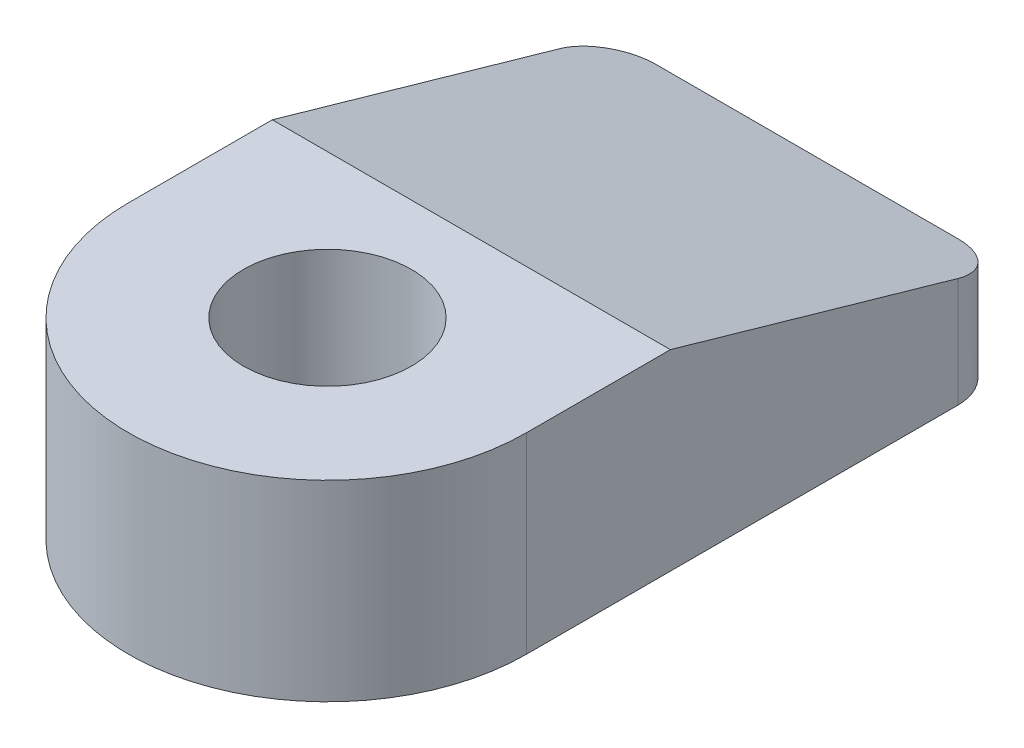
ISO-10303-21;
HEADER;
FILE_DESCRIPTION(('STEP AP214'),'2;1');
FILE_NAME('part.step','',(''),(''),'','','');
FILE_SCHEMA(('AUTOMOTIVE_DESIGN { 1 0 10303 214 1 1 1 1 }'));
ENDSEC;
DATA;
#1=APPLICATION_CONTEXT('core data for automotive mechanical design processes');
#2=APPLICATION_PROTOCOL_DEFINITION('international standard','automotive_design',2000,#1);
#3=PRODUCT_CONTEXT('',#1,'mechanical');
#4=PRODUCT('Part','Part','',(#3));
#5=PRODUCT_RELATED_PRODUCT_CATEGORY('part','',(#4));
#6=PRODUCT_DEFINITION_FORMATION('','',#4);
#7=PRODUCT_DEFINITION_CONTEXT('part definition',#1,'design');
#8=PRODUCT_DEFINITION('design','',#6,#7);
#9=PRODUCT_DEFINITION_SHAPE('','',#8);
#10=(LENGTH_UNIT() NAMED_UNIT(*) SI_UNIT(.MILLI.,.METRE.));
#11=(NAMED_UNIT(*) PLANE_ANGLE_UNIT() SI_UNIT($,.RADIAN.));
#12=(NAMED_UNIT(*) SI_UNIT($,.STERADIAN.) SOLID_ANGLE_UNIT());
#13=UNCERTAINTY_MEASURE_WITH_UNIT(LENGTH_MEASURE(1.E-05),#10,'distance_accuracy_value','');
#14=(GEOMETRIC_REPRESENTATION_CONTEXT(3) GLOBAL_UNCERTAINTY_ASSIGNED_CONTEXT((#13)) GLOBAL_UNIT_ASSIGNED_CONTEXT((#10,
#11,#12)) REPRESENTATION_CONTEXT('',''));
#15=CARTESIAN_POINT('',(0.,0.,0.));
#16=DIRECTION('',(0.,0.,1.));
#17=DIRECTION('',(1.,0.,0.));
#18=AXIS2_PLACEMENT_3D('',#15,#16,#17);
#19=CARTESIAN_POINT('',(0.,4.,0.));
#20=DIRECTION('',(0.,1.,0.));
#21=DIRECTION('',(0.,0.,1.));
#22=AXIS2_PLACEMENT_3D('',#19,#20,#21);
#23=PLANE('',#22);
#24=DIRECTION('',(1.,0.,0.));
#25=VECTOR('',#24,1.);
#26=CARTESIAN_POINT('',(-4.15,4.,-3.));
#27=LINE('',#26,#25);
#28=CARTESIAN_POINT('',(-4.15,4.,-3.));
#29=VERTEX_POINT('',#28);
#30=CARTESIAN_POINT('',(4.15,4.,-3.));
#31=VERTEX_POINT('',#30);
#32=EDGE_CURVE('E94',#29,#31,#27,.T.);
#33=ORIENTED_EDGE('',*,*,#32,.F.);
#34=DIRECTION('',(0.,0.,1.));
#35=VECTOR('',#34,1.);
#36=CARTESIAN_POINT('',(-4.15,4.,0.));
#37=LINE('',#36,#35);
#38=CARTESIAN_POINT('',(-4.15,4.,0.));
#39=VERTEX_POINT('',#38);
#40=EDGE_CURVE('E107',#29,#39,#37,.T.);
#41=ORIENTED_EDGE('',*,*,#40,.T.);
#42=CARTESIAN_POINT('',(0.,4.,0.));
#43=DIRECTION('',(0.,1.,0.));
#44=DIRECTION('',(0.,0.,1.));
#45=AXIS2_PLACEMENT_3D('',#42,#43,#44);
#46=CIRCLE('',#45,4.15);
#47=CARTESIAN_POINT('',(4.15,4.,0.));
#48=VERTEX_POINT('',#47);
#49=EDGE_CURVE('E119',#39,#48,#46,.T.);
#50=ORIENTED_EDGE('',*,*,#49,.T.);
#51=DIRECTION('',(0.,0.,-1.));
#52=VECTOR('',#51,1.);
#53=CARTESIAN_POINT('',(4.15,4.,-10.));
#54=LINE('',#53,#52);
#55=EDGE_CURVE('E109',#48,#31,#54,.T.);
#56=ORIENTED_EDGE('',*,*,#55,.T.);
#57=EDGE_LOOP('',(#33,#41,#50,#56));
#58=FACE_BOUND('',#57,.T.);
#59=CARTESIAN_POINT('',(0.,4.,0.));
#60=DIRECTION('',(0.,1.,0.));
#61=DIRECTION('',(0.,0.,1.));
#62=AXIS2_PLACEMENT_3D('',#59,#60,#61);
#63=CIRCLE('',#62,1.75);
#64=CARTESIAN_POINT('',(0.,4.,1.75));
#65=VERTEX_POINT('',#64);
#66=EDGE_CURVE('E127',#65,#65,#63,.T.);
#67=ORIENTED_EDGE('',*,*,#66,.F.);
#68=EDGE_LOOP('',(#67));
#69=FACE_BOUND('',#68,.T.);
#70=ADVANCED_FACE('F33',(#58,#69),#23,.T.);
#71=CARTESIAN_POINT('',(0.,0.,0.));
#72=DIRECTION('',(0.,1.,0.));
#73=DIRECTION('',(0.,0.,1.));
#74=AXIS2_PLACEMENT_3D('',#71,#72,#73);
#75=PLANE('',#74);
#76=DIRECTION('',(0.,0.,1.));
#77=VECTOR('',#76,1.);
#78=CARTESIAN_POINT('',(-4.15,0.,0.));
#79=LINE('',#78,#77);
#80=CARTESIAN_POINT('',(-4.15,0.,-9.));
#81=VERTEX_POINT('',#80);
#82=CARTESIAN_POINT('',(-4.15,0.,0.));
#83=VERTEX_POINT('',#82);
#84=EDGE_CURVE('E132',#81,#83,#79,.T.);
#85=ORIENTED_EDGE('',*,*,#84,.F.);
#86=CARTESIAN_POINT('',(-3.15,0.,-9.));
#87=DIRECTION('',(0.,1.,0.));
#88=DIRECTION('',(0.,0.,1.));
#89=AXIS2_PLACEMENT_3D('',#86,#87,#88);
#90=CIRCLE('',#89,1.);
#91=CARTESIAN_POINT('',(-3.15,0.,-10.));
#92=VERTEX_POINT('',#91);
#93=EDGE_CURVE('E140',#81,#92,#90,.F.);
#94=ORIENTED_EDGE('',*,*,#93,.T.);
#95=DIRECTION('',(-1.,0.,0.));
#96=VECTOR('',#95,1.);
#97=CARTESIAN_POINT('',(-4.15,0.,-10.));
#98=LINE('',#97,#96);
#99=CARTESIAN_POINT('',(3.15,0.,-10.));
#100=VERTEX_POINT('',#99);
#101=EDGE_CURVE('E129',#100,#92,#98,.T.);
#102=ORIENTED_EDGE('',*,*,#101,.F.);
#103=CARTESIAN_POINT('',(3.15,0.,-9.));
#104=DIRECTION('',(0.,1.,0.));
#105=DIRECTION('',(0.,0.,1.));
#106=AXIS2_PLACEMENT_3D('',#103,#104,#105);
#107=CIRCLE('',#106,1.);
#108=CARTESIAN_POINT('',(4.15,0.,-9.));
#109=VERTEX_POINT('',#108);
#110=EDGE_CURVE('E138',#100,#109,#107,.F.);
#111=ORIENTED_EDGE('',*,*,#110,.T.);
#112=DIRECTION('',(0.,0.,-1.));
#113=VECTOR('',#112,1.);
#114=CARTESIAN_POINT('',(4.15,0.,-10.));
#115=LINE('',#114,#113);
#116=CARTESIAN_POINT('',(4.15,0.,0.));
#117=VERTEX_POINT('',#116);
#118=EDGE_CURVE('E126',#117,#109,#115,.T.);
#119=ORIENTED_EDGE('',*,*,#118,.F.);
#120=CARTESIAN_POINT('',(0.,0.,0.));
#121=DIRECTION('',(0.,1.,0.));
#122=DIRECTION('',(0.,0.,1.));
#123=AXIS2_PLACEMENT_3D('',#120,#121,#122);
#124=CIRCLE('',#123,4.15);
#125=EDGE_CURVE('E123',#83,#117,#124,.T.);
#126=ORIENTED_EDGE('',*,*,#125,.F.);
#127=EDGE_LOOP('',(#85,#94,#102,#111,#119,#126));
#128=FACE_BOUND('',#127,.T.);
#129=CARTESIAN_POINT('',(0.,0.,0.));
#130=DIRECTION('',(0.,1.,0.));
#131=DIRECTION('',(0.,0.,1.));
#132=AXIS2_PLACEMENT_3D('',#129,#130,#131);
#133=CIRCLE('',#132,1.75);
#134=CARTESIAN_POINT('',(0.,0.,1.75));
#135=VERTEX_POINT('',#134);
#136=EDGE_CURVE('E110',#135,#135,#133,.T.);
#137=ORIENTED_EDGE('',*,*,#136,.T.);
#138=EDGE_LOOP('',(#137));
#139=FACE_BOUND('',#138,.T.);
#140=ADVANCED_FACE('F158',(#128,#139),#75,.F.);
#141=CARTESIAN_POINT('',(0.,4.,0.));
#142=DIRECTION('',(0.,-1.,0.));
#143=DIRECTION('',(0.,0.,-1.));
#144=AXIS2_PLACEMENT_3D('',#141,#142,#143);
#145=CYLINDRICAL_SURFACE('',#144,4.15);
#146=ORIENTED_EDGE('',*,*,#125,.T.);
#147=DIRECTION('',(0.,-1.,0.));
#148=VECTOR('',#147,1.);
#149=CARTESIAN_POINT('',(4.15,4.,0.));
#150=LINE('',#149,#148);
#151=EDGE_CURVE('E117',#48,#117,#150,.T.);
#152=ORIENTED_EDGE('',*,*,#151,.F.);
#153=ORIENTED_EDGE('',*,*,#49,.F.);
#154=DIRECTION('',(0.,-1.,0.));
#155=VECTOR('',#154,1.);
#156=CARTESIAN_POINT('',(-4.15,4.,0.));
#157=LINE('',#156,#155);
#158=EDGE_CURVE('E114',#39,#83,#157,.T.);
#159=ORIENTED_EDGE('',*,*,#158,.T.);
#160=EDGE_LOOP('',(#146,#152,#153,#159));
#161=FACE_BOUND('',#160,.T.);
#162=ADVANCED_FACE('F162',(#161),#145,.T.);
#163=CARTESIAN_POINT('',(4.15,4.,-10.));
#164=DIRECTION('',(-1.,0.,0.));
#165=DIRECTION('',(0.,0.,1.));
#166=AXIS2_PLACEMENT_3D('',#163,#164,#165);
#167=PLANE('',#166);
#168=ORIENTED_EDGE('',*,*,#118,.T.);
#169=DIRECTION('',(0.,-1.,0.));
#170=VECTOR('',#169,1.);
#171=CARTESIAN_POINT('',(4.15,4.,-9.));
#172=LINE('',#171,#170);
#173=CARTESIAN_POINT('',(4.15,2.28571428571429,-9.));
#174=VERTEX_POINT('',#173);
#175=EDGE_CURVE('E11',#109,#174,#172,.F.);
#176=ORIENTED_EDGE('',*,*,#175,.T.);
#177=DIRECTION('',(0.,-0.274721127897378,-0.961523947640823));
#178=VECTOR('',#177,1.);
#179=CARTESIAN_POINT('',(4.15,4.,-3.));
#180=LINE('',#179,#178);
#181=EDGE_CURVE('E101',#31,#174,#180,.T.);
#182=ORIENTED_EDGE('',*,*,#181,.F.);
#183=ORIENTED_EDGE('',*,*,#55,.F.);
#184=ORIENTED_EDGE('',*,*,#151,.T.);
#185=EDGE_LOOP('',(#168,#176,#182,#183,#184));
#186=FACE_BOUND('',#185,.T.);
#187=ADVANCED_FACE('F169',(#186),#167,.F.);
#188=CARTESIAN_POINT('',(-4.15,4.,-10.));
#189=DIRECTION('',(0.,0.,1.));
#190=DIRECTION('',(1.,0.,0.));
#191=AXIS2_PLACEMENT_3D('',#188,#189,#190);
#192=PLANE('',#191);
#193=ORIENTED_EDGE('',*,*,#101,.T.);
#194=DIRECTION('',(0.,-1.,0.));
#195=VECTOR('',#194,1.);
#196=CARTESIAN_POINT('',(-3.15,4.,-10.));
#197=LINE('',#196,#195);
#198=CARTESIAN_POINT('',(-3.15,2.,-10.));
#199=VERTEX_POINT('',#198);
#200=EDGE_CURVE('E145',#92,#199,#197,.F.);
#201=ORIENTED_EDGE('',*,*,#200,.T.);
#202=DIRECTION('',(1.,0.,0.));
#203=VECTOR('',#202,1.);
#204=CARTESIAN_POINT('',(-4.15,2.,-10.));
#205=LINE('',#204,#203);
#206=CARTESIAN_POINT('',(3.15,2.,-10.));
#207=VERTEX_POINT('',#206);
#208=EDGE_CURVE('E100',#199,#207,#205,.T.);
#209=ORIENTED_EDGE('',*,*,#208,.T.);
#210=DIRECTION('',(0.,-1.,0.));
#211=VECTOR('',#210,1.);
#212=CARTESIAN_POINT('',(3.15,4.,-10.));
#213=LINE('',#212,#211);
#214=EDGE_CURVE('E142',#207,#100,#213,.T.);
#215=ORIENTED_EDGE('',*,*,#214,.T.);
#216=EDGE_LOOP('',(#193,#201,#209,#215));
#217=FACE_BOUND('',#216,.T.);
#218=ADVANCED_FACE('F149',(#217),#192,.F.);
#219=CARTESIAN_POINT('',(-4.15,4.,0.));
#220=DIRECTION('',(1.,0.,0.));
#221=DIRECTION('',(0.,0.,-1.));
#222=AXIS2_PLACEMENT_3D('',#219,#220,#221);
#223=PLANE('',#222);
#224=DIRECTION('',(0.,-0.274721127897378,-0.961523947640823));
#225=VECTOR('',#224,1.);
#226=CARTESIAN_POINT('',(-4.15,4.,-3.));
#227=LINE('',#226,#225);
#228=CARTESIAN_POINT('',(-4.15,2.28571428571429,-9.));
#229=VERTEX_POINT('',#228);
#230=EDGE_CURVE('E91',#29,#229,#227,.T.);
#231=ORIENTED_EDGE('',*,*,#230,.T.);
#232=DIRECTION('',(0.,-1.,0.));
#233=VECTOR('',#232,1.);
#234=CARTESIAN_POINT('',(-4.15,4.,-9.));
#235=LINE('',#234,#233);
#236=EDGE_CURVE('E136',#229,#81,#235,.T.);
#237=ORIENTED_EDGE('',*,*,#236,.T.);
#238=ORIENTED_EDGE('',*,*,#84,.T.);
#239=ORIENTED_EDGE('',*,*,#158,.F.);
#240=ORIENTED_EDGE('',*,*,#40,.F.);
#241=EDGE_LOOP('',(#231,#237,#238,#239,#240));
#242=FACE_BOUND('',#241,.T.);
#243=ADVANCED_FACE('F112',(#242),#223,.F.);
#244=CARTESIAN_POINT('',(0.,4.,0.));
#245=DIRECTION('',(0.,-1.,0.));
#246=DIRECTION('',(0.,0.,-1.));
#247=AXIS2_PLACEMENT_3D('',#244,#245,#246);
#248=CYLINDRICAL_SURFACE('',#247,1.75);
#249=ORIENTED_EDGE('',*,*,#66,.T.);
#250=EDGE_LOOP('',(#249));
#251=FACE_BOUND('',#250,.T.);
#252=ORIENTED_EDGE('',*,*,#136,.F.);
#253=EDGE_LOOP('',(#252));
#254=FACE_BOUND('',#253,.T.);
#255=ADVANCED_FACE('F185',(#251,#254),#248,.F.);
#256=CARTESIAN_POINT('',(-4.15,4.,-3.));
#257=DIRECTION('',(0.,-0.961523947640823,0.274721127897378));
#258=DIRECTION('',(0.,-0.274721127897378,-0.961523947640823));
#259=AXIS2_PLACEMENT_3D('',#256,#257,#258);
#260=PLANE('',#259);
#261=ORIENTED_EDGE('',*,*,#208,.F.);
#262=CARTESIAN_POINT('',(-3.15,2.28571428571429,-9.));
#263=DIRECTION('',(0.,-0.961523947640823,0.274721127897378));
#264=DIRECTION('',(0.,-0.274721127897378,-0.961523947640823));
#265=AXIS2_PLACEMENT_3D('',#262,#263,#264);
#266=ELLIPSE('',#265,1.04001569846865,1.);
#267=EDGE_CURVE('E41',#199,#229,#266,.F.);
#268=ORIENTED_EDGE('',*,*,#267,.T.);
#269=ORIENTED_EDGE('',*,*,#230,.F.);
#270=ORIENTED_EDGE('',*,*,#32,.T.);
#271=ORIENTED_EDGE('',*,*,#181,.T.);
#272=CARTESIAN_POINT('',(3.15,2.28571428571429,-9.));
#273=DIRECTION('',(0.,-0.961523947640823,0.274721127897378));
#274=DIRECTION('',(0.,-0.274721127897378,-0.961523947640823));
#275=AXIS2_PLACEMENT_3D('',#272,#273,#274);
#276=ELLIPSE('',#275,1.04001569846865,1.);
#277=EDGE_CURVE('E53',#174,#207,#276,.F.);
#278=ORIENTED_EDGE('',*,*,#277,.T.);
#279=EDGE_LOOP('',(#261,#268,#269,#270,#271,#278));
#280=FACE_BOUND('',#279,.T.);
#281=ADVANCED_FACE('F93',(#280),#260,.F.);
#282=CARTESIAN_POINT('',(-3.15,4.,-9.));
#283=DIRECTION('',(0.,-1.,0.));
#284=DIRECTION('',(0.,0.,-1.));
#285=AXIS2_PLACEMENT_3D('',#282,#283,#284);
#286=CYLINDRICAL_SURFACE('',#285,1.);
#287=ORIENTED_EDGE('',*,*,#267,.F.);
#288=ORIENTED_EDGE('',*,*,#200,.F.);
#289=ORIENTED_EDGE('',*,*,#93,.F.);
#290=ORIENTED_EDGE('',*,*,#236,.F.);
#291=EDGE_LOOP('',(#287,#288,#289,#290));
#292=FACE_BOUND('',#291,.T.);
#293=ADVANCED_FACE('F154',(#292),#286,.T.);
#294=CARTESIAN_POINT('',(3.15,4.,-9.));
#295=DIRECTION('',(0.,-1.,0.));
#296=DIRECTION('',(0.,0.,-1.));
#297=AXIS2_PLACEMENT_3D('',#294,#295,#296);
#298=CYLINDRICAL_SURFACE('',#297,1.);
#299=ORIENTED_EDGE('',*,*,#277,.F.);
#300=ORIENTED_EDGE('',*,*,#175,.F.);
#301=ORIENTED_EDGE('',*,*,#110,.F.);
#302=ORIENTED_EDGE('',*,*,#214,.F.);
#303=EDGE_LOOP('',(#299,#300,#301,#302));
#304=FACE_BOUND('',#303,.T.);
#305=ADVANCED_FACE('F35',(#304),#298,.T.);
#306=CLOSED_SHELL('',(#70,#140,#162,#187,#218,#243,#255,#281,#293,#305));
#307=MANIFOLD_SOLID_BREP('B2',#306);
#308=ADVANCED_BREP_SHAPE_REPRESENTATION('',(#18,#307),#14);
#309=SHAPE_DEFINITION_REPRESENTATION(#9,#308);
ENDSEC;
END-ISO-10303-21;
